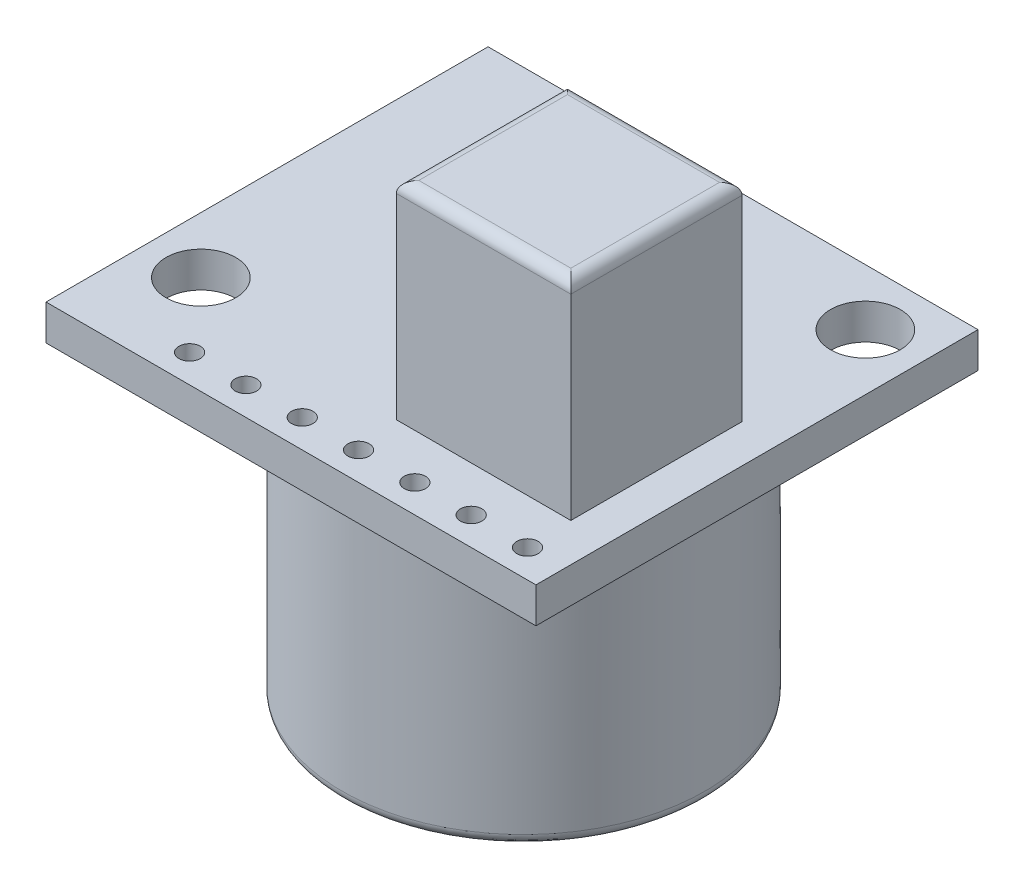
ISO-10303-21;
HEADER;
FILE_DESCRIPTION(('STEP AP214'),'2;1');
FILE_NAME('part.step','',(''),(''),'','','');
FILE_SCHEMA(('AUTOMOTIVE_DESIGN { 1 0 10303 214 1 1 1 1 }'));
ENDSEC;
DATA;
#1=APPLICATION_CONTEXT('core data for automotive mechanical design processes');
#2=APPLICATION_PROTOCOL_DEFINITION('international standard','automotive_design',2000,#1);
#3=PRODUCT_CONTEXT('',#1,'mechanical');
#4=PRODUCT('Part','Part','',(#3));
#5=PRODUCT_RELATED_PRODUCT_CATEGORY('part','',(#4));
#6=PRODUCT_DEFINITION_FORMATION('','',#4);
#7=PRODUCT_DEFINITION_CONTEXT('part definition',#1,'design');
#8=PRODUCT_DEFINITION('design','',#6,#7);
#9=PRODUCT_DEFINITION_SHAPE('','',#8);
#10=(LENGTH_UNIT() NAMED_UNIT(*) SI_UNIT(.MILLI.,.METRE.));
#11=(NAMED_UNIT(*) PLANE_ANGLE_UNIT() SI_UNIT($,.RADIAN.));
#12=(NAMED_UNIT(*) SI_UNIT($,.STERADIAN.) SOLID_ANGLE_UNIT());
#13=UNCERTAINTY_MEASURE_WITH_UNIT(LENGTH_MEASURE(1.E-05),#10,'distance_accuracy_value','');
#14=(GEOMETRIC_REPRESENTATION_CONTEXT(3) GLOBAL_UNCERTAINTY_ASSIGNED_CONTEXT((#13)) GLOBAL_UNIT_ASSIGNED_CONTEXT((#10,
#11,#12)) REPRESENTATION_CONTEXT('',''));
#15=CARTESIAN_POINT('',(0.,0.,0.));
#16=DIRECTION('',(0.,0.,1.));
#17=DIRECTION('',(1.,0.,0.));
#18=AXIS2_PLACEMENT_3D('',#15,#16,#17);
#19=CARTESIAN_POINT('',(0.,0.,0.));
#20=DIRECTION('',(0.,1.,0.));
#21=DIRECTION('',(0.,0.,1.));
#22=AXIS2_PLACEMENT_3D('',#19,#20,#21);
#23=PLANE('',#22);
#24=CARTESIAN_POINT('',(-5.842,0.,8.6995000000001));
#25=DIRECTION('',(0.,1.,0.));
#26=DIRECTION('',(0.,0.,1.));
#27=AXIS2_PLACEMENT_3D('',#24,#25,#26);
#28=CIRCLE('',#27,0.482599999999999);
#29=CARTESIAN_POINT('',(-5.842,0.,9.1821000000001));
#30=VERTEX_POINT('',#29);
#31=EDGE_CURVE('E201',#30,#30,#28,.T.);
#32=ORIENTED_EDGE('',*,*,#31,.T.);
#33=EDGE_LOOP('',(#32));
#34=FACE_BOUND('',#33,.T.);
#35=CARTESIAN_POINT('',(-3.302,0.,8.69950000000009));
#36=DIRECTION('',(0.,1.,0.));
#37=DIRECTION('',(0.,0.,1.));
#38=AXIS2_PLACEMENT_3D('',#35,#36,#37);
#39=CIRCLE('',#38,0.482599999999999);
#40=CARTESIAN_POINT('',(-3.302,0.,9.18210000000009));
#41=VERTEX_POINT('',#40);
#42=EDGE_CURVE('E205',#41,#41,#39,.T.);
#43=ORIENTED_EDGE('',*,*,#42,.T.);
#44=EDGE_LOOP('',(#43));
#45=FACE_BOUND('',#44,.T.);
#46=CARTESIAN_POINT('',(-0.762000000000002,0.,8.69950000000007));
#47=DIRECTION('',(0.,1.,0.));
#48=DIRECTION('',(0.,0.,1.));
#49=AXIS2_PLACEMENT_3D('',#46,#47,#48);
#50=CIRCLE('',#49,0.482599999999999);
#51=CARTESIAN_POINT('',(-0.762000000000002,0.,9.18210000000007));
#52=VERTEX_POINT('',#51);
#53=EDGE_CURVE('E211',#52,#52,#50,.T.);
#54=ORIENTED_EDGE('',*,*,#53,.T.);
#55=EDGE_LOOP('',(#54));
#56=FACE_BOUND('',#55,.T.);
#57=CARTESIAN_POINT('',(1.778,0.,8.69950000000005));
#58=DIRECTION('',(0.,1.,0.));
#59=DIRECTION('',(0.,0.,1.));
#60=AXIS2_PLACEMENT_3D('',#57,#58,#59);
#61=CIRCLE('',#60,0.482599999999999);
#62=CARTESIAN_POINT('',(1.778,0.,9.18210000000005));
#63=VERTEX_POINT('',#62);
#64=EDGE_CURVE('E217',#63,#63,#61,.T.);
#65=ORIENTED_EDGE('',*,*,#64,.T.);
#66=EDGE_LOOP('',(#65));
#67=FACE_BOUND('',#66,.T.);
#68=CARTESIAN_POINT('',(4.318,0.,8.69950000000003));
#69=DIRECTION('',(0.,1.,0.));
#70=DIRECTION('',(0.,0.,1.));
#71=AXIS2_PLACEMENT_3D('',#68,#69,#70);
#72=CIRCLE('',#71,0.482599999999999);
#73=CARTESIAN_POINT('',(4.318,0.,9.18210000000003));
#74=VERTEX_POINT('',#73);
#75=EDGE_CURVE('E223',#74,#74,#72,.T.);
#76=ORIENTED_EDGE('',*,*,#75,.T.);
#77=EDGE_LOOP('',(#76));
#78=FACE_BOUND('',#77,.T.);
#79=CARTESIAN_POINT('',(6.858,0.,8.69950000000001));
#80=DIRECTION('',(0.,1.,0.));
#81=DIRECTION('',(0.,0.,1.));
#82=AXIS2_PLACEMENT_3D('',#79,#80,#81);
#83=CIRCLE('',#82,0.482599999999999);
#84=CARTESIAN_POINT('',(6.858,0.,9.18210000000001));
#85=VERTEX_POINT('',#84);
#86=EDGE_CURVE('E229',#85,#85,#83,.T.);
#87=ORIENTED_EDGE('',*,*,#86,.T.);
#88=EDGE_LOOP('',(#87));
#89=FACE_BOUND('',#88,.T.);
#90=CARTESIAN_POINT('',(9.398,0.,8.6995));
#91=DIRECTION('',(0.,1.,0.));
#92=DIRECTION('',(0.,0.,1.));
#93=AXIS2_PLACEMENT_3D('',#90,#91,#92);
#94=CIRCLE('',#93,0.482599999999999);
#95=CARTESIAN_POINT('',(9.398,0.,9.1821));
#96=VERTEX_POINT('',#95);
#97=EDGE_CURVE('E235',#96,#96,#94,.T.);
#98=ORIENTED_EDGE('',*,*,#97,.T.);
#99=EDGE_LOOP('',(#98));
#100=FACE_BOUND('',#99,.T.);
#101=CARTESIAN_POINT('',(-8.509,0.,5.5245));
#102=DIRECTION('',(0.,1.,0.));
#103=DIRECTION('',(0.,0.,1.));
#104=AXIS2_PLACEMENT_3D('',#101,#102,#103);
#105=CIRCLE('',#104,1.5748);
#106=CARTESIAN_POINT('',(-8.509,0.,7.0993));
#107=VERTEX_POINT('',#106);
#108=EDGE_CURVE('E241',#107,#107,#105,.T.);
#109=ORIENTED_EDGE('',*,*,#108,.T.);
#110=EDGE_LOOP('',(#109));
#111=FACE_BOUND('',#110,.T.);
#112=CARTESIAN_POINT('',(8.509,0.,-7.4295));
#113=DIRECTION('',(0.,1.,0.));
#114=DIRECTION('',(0.,0.,1.));
#115=AXIS2_PLACEMENT_3D('',#112,#113,#114);
#116=CIRCLE('',#115,1.5748);
#117=CARTESIAN_POINT('',(8.509,0.,-5.8547));
#118=VERTEX_POINT('',#117);
#119=EDGE_CURVE('E247',#118,#118,#116,.T.);
#120=ORIENTED_EDGE('',*,*,#119,.T.);
#121=EDGE_LOOP('',(#120));
#122=FACE_BOUND('',#121,.T.);
#123=DIRECTION('',(0.,0.,1.));
#124=VECTOR('',#123,1.);
#125=CARTESIAN_POINT('',(-11.049,0.,-9.9695));
#126=LINE('',#125,#124);
#127=CARTESIAN_POINT('',(-11.049,0.,-9.9695));
#128=VERTEX_POINT('',#127);
#129=CARTESIAN_POINT('',(-11.049,0.,9.9695));
#130=VERTEX_POINT('',#129);
#131=EDGE_CURVE('E253',#128,#130,#126,.T.);
#132=ORIENTED_EDGE('',*,*,#131,.F.);
#133=DIRECTION('',(-1.,0.,0.));
#134=VECTOR('',#133,1.);
#135=CARTESIAN_POINT('',(-11.049,0.,-9.9695));
#136=LINE('',#135,#134);
#137=CARTESIAN_POINT('',(11.049,0.,-9.9695));
#138=VERTEX_POINT('',#137);
#139=EDGE_CURVE('E260',#138,#128,#136,.T.);
#140=ORIENTED_EDGE('',*,*,#139,.F.);
#141=DIRECTION('',(0.,0.,-1.));
#142=VECTOR('',#141,1.);
#143=CARTESIAN_POINT('',(11.049,0.,-9.9695));
#144=LINE('',#143,#142);
#145=CARTESIAN_POINT('',(11.049,0.,9.9695));
#146=VERTEX_POINT('',#145);
#147=EDGE_CURVE('E271',#146,#138,#144,.T.);
#148=ORIENTED_EDGE('',*,*,#147,.F.);
#149=DIRECTION('',(1.,0.,0.));
#150=VECTOR('',#149,1.);
#151=CARTESIAN_POINT('',(-11.049,0.,9.9695));
#152=LINE('',#151,#150);
#153=EDGE_CURVE('E269',#130,#146,#152,.T.);
#154=ORIENTED_EDGE('',*,*,#153,.F.);
#155=EDGE_LOOP('',(#132,#140,#148,#154));
#156=FACE_BOUND('',#155,.T.);
#157=DIRECTION('',(0.,0.,1.));
#158=VECTOR('',#157,1.);
#159=CARTESIAN_POINT('',(-5.969,0.,-7.9375));
#160=LINE('',#159,#158);
#161=CARTESIAN_POINT('',(-5.969,0.,-7.9375));
#162=VERTEX_POINT('',#161);
#163=CARTESIAN_POINT('',(-5.969,0.,-6.13066535194291));
#164=VERTEX_POINT('',#163);
#165=EDGE_CURVE('E327',#162,#164,#160,.T.);
#166=ORIENTED_EDGE('',*,*,#165,.F.);
#167=DIRECTION('',(1.,0.,0.));
#168=VECTOR('',#167,1.);
#169=CARTESIAN_POINT('',(-10.541,0.,-7.9375));
#170=LINE('',#169,#168);
#171=CARTESIAN_POINT('',(-10.541,0.,-7.9375));
#172=VERTEX_POINT('',#171);
#173=EDGE_CURVE('E325',#172,#162,#170,.T.);
#174=ORIENTED_EDGE('',*,*,#173,.F.);
#175=DIRECTION('',(0.,0.,-1.));
#176=VECTOR('',#175,1.);
#177=CARTESIAN_POINT('',(-10.541,0.,-7.9375));
#178=LINE('',#177,#176);
#179=CARTESIAN_POINT('',(-10.541,0.,-1.3335));
#180=VERTEX_POINT('',#179);
#181=EDGE_CURVE('E170',#180,#172,#178,.T.);
#182=ORIENTED_EDGE('',*,*,#181,.F.);
#183=DIRECTION('',(-1.,0.,0.));
#184=VECTOR('',#183,1.);
#185=CARTESIAN_POINT('',(-10.541,0.,-1.3335));
#186=LINE('',#185,#184);
#187=CARTESIAN_POINT('',(-8.15107529164097,0.,-1.3335));
#188=VERTEX_POINT('',#187);
#189=EDGE_CURVE('E167',#188,#180,#186,.T.);
#190=ORIENTED_EDGE('',*,*,#189,.F.);
#191=CARTESIAN_POINT('',(0.,0.,-0.520699999999999));
#192=DIRECTION('',(0.,-1.,0.));
#193=DIRECTION('',(0.,0.,-1.));
#194=AXIS2_PLACEMENT_3D('',#191,#192,#193);
#195=CIRCLE('',#194,8.1915);
#196=EDGE_CURVE('E180',#164,#188,#195,.T.);
#197=ORIENTED_EDGE('',*,*,#196,.F.);
#198=EDGE_LOOP('',(#166,#174,#182,#190,#197));
#199=FACE_BOUND('',#198,.T.);
#200=ADVANCED_FACE('F37',(#34,#45,#56,#67,#78,#89,#100,#111,#122,#156,#199),#23,.F.);
#201=CARTESIAN_POINT('',(0.,-13.6398,-0.520699999999999));
#202=DIRECTION('',(0.,1.,0.));
#203=DIRECTION('',(0.,0.,1.));
#204=AXIS2_PLACEMENT_3D('',#201,#202,#203);
#205=CYLINDRICAL_SURFACE('',#204,8.1915);
#206=CARTESIAN_POINT('',(0.,-13.1318,-0.520699999999999));
#207=DIRECTION('',(0.,-1.,0.));
#208=DIRECTION('',(0.,0.,-1.));
#209=AXIS2_PLACEMENT_3D('',#206,#207,#208);
#210=CIRCLE('',#209,8.1915);
#211=CARTESIAN_POINT('',(0.,-13.1318,-8.7122));
#212=VERTEX_POINT('',#211);
#213=EDGE_CURVE('E294',#212,#212,#210,.F.);
#214=ORIENTED_EDGE('',*,*,#213,.T.);
#215=EDGE_LOOP('',(#214));
#216=FACE_BOUND('',#215,.T.);
#217=DIRECTION('',(0.,1.,0.));
#218=VECTOR('',#217,1.);
#219=CARTESIAN_POINT('',(-5.969,-13.6398,-6.13066535194291));
#220=LINE('',#219,#218);
#221=CARTESIAN_POINT('',(-5.969,-2.032,-6.13066535194291));
#222=VERTEX_POINT('',#221);
#223=EDGE_CURVE('E288',#164,#222,#220,.F.);
#224=ORIENTED_EDGE('',*,*,#223,.F.);
#225=ORIENTED_EDGE('',*,*,#196,.T.);
#226=DIRECTION('',(0.,1.,0.));
#227=VECTOR('',#226,1.);
#228=CARTESIAN_POINT('',(-8.15107529164097,-13.6398,-1.3335));
#229=LINE('',#228,#227);
#230=CARTESIAN_POINT('',(-8.15107529164097,-2.032,-1.3335));
#231=VERTEX_POINT('',#230);
#232=EDGE_CURVE('E285',#231,#188,#229,.T.);
#233=ORIENTED_EDGE('',*,*,#232,.F.);
#234=CARTESIAN_POINT('',(0.,-2.032,-0.520699999999999));
#235=DIRECTION('',(0.,1.,0.));
#236=DIRECTION('',(0.,0.,1.));
#237=AXIS2_PLACEMENT_3D('',#234,#235,#236);
#238=CIRCLE('',#237,8.1915);
#239=EDGE_CURVE('E182',#222,#231,#238,.T.);
#240=ORIENTED_EDGE('',*,*,#239,.F.);
#241=EDGE_LOOP('',(#224,#225,#233,#240));
#242=FACE_BOUND('',#241,.T.);
#243=ADVANCED_FACE('F339',(#216,#242),#205,.T.);
#244=CARTESIAN_POINT('',(0.,1.6002,0.));
#245=DIRECTION('',(0.,1.,0.));
#246=DIRECTION('',(0.,0.,1.));
#247=AXIS2_PLACEMENT_3D('',#244,#245,#246);
#248=PLANE('',#247);
#249=CARTESIAN_POINT('',(-3.302,1.6002,8.69950000000009));
#250=DIRECTION('',(0.,1.,0.));
#251=DIRECTION('',(0.,0.,1.));
#252=AXIS2_PLACEMENT_3D('',#249,#250,#251);
#253=CIRCLE('',#252,0.482599999999999);
#254=CARTESIAN_POINT('',(-3.302,1.6002,9.18210000000009));
#255=VERTEX_POINT('',#254);
#256=EDGE_CURVE('E208',#255,#255,#253,.T.);
#257=ORIENTED_EDGE('',*,*,#256,.F.);
#258=EDGE_LOOP('',(#257));
#259=FACE_BOUND('',#258,.T.);
#260=CARTESIAN_POINT('',(1.778,1.6002,8.69950000000005));
#261=DIRECTION('',(0.,1.,0.));
#262=DIRECTION('',(0.,0.,1.));
#263=AXIS2_PLACEMENT_3D('',#260,#261,#262);
#264=CIRCLE('',#263,0.482599999999999);
#265=CARTESIAN_POINT('',(1.778,1.6002,9.18210000000005));
#266=VERTEX_POINT('',#265);
#267=EDGE_CURVE('E220',#266,#266,#264,.T.);
#268=ORIENTED_EDGE('',*,*,#267,.F.);
#269=EDGE_LOOP('',(#268));
#270=FACE_BOUND('',#269,.T.);
#271=CARTESIAN_POINT('',(6.858,1.6002,8.69950000000001));
#272=DIRECTION('',(0.,1.,0.));
#273=DIRECTION('',(0.,0.,1.));
#274=AXIS2_PLACEMENT_3D('',#271,#272,#273);
#275=CIRCLE('',#274,0.482599999999999);
#276=CARTESIAN_POINT('',(6.858,1.6002,9.18210000000001));
#277=VERTEX_POINT('',#276);
#278=EDGE_CURVE('E232',#277,#277,#275,.T.);
#279=ORIENTED_EDGE('',*,*,#278,.F.);
#280=EDGE_LOOP('',(#279));
#281=FACE_BOUND('',#280,.T.);
#282=CARTESIAN_POINT('',(-8.509,1.6002,5.5245));
#283=DIRECTION('',(0.,1.,0.));
#284=DIRECTION('',(0.,0.,1.));
#285=AXIS2_PLACEMENT_3D('',#282,#283,#284);
#286=CIRCLE('',#285,1.5748);
#287=CARTESIAN_POINT('',(-8.509,1.6002,7.0993));
#288=VERTEX_POINT('',#287);
#289=EDGE_CURVE('E244',#288,#288,#286,.T.);
#290=ORIENTED_EDGE('',*,*,#289,.F.);
#291=EDGE_LOOP('',(#290));
#292=FACE_BOUND('',#291,.T.);
#293=DIRECTION('',(0.,0.,1.));
#294=VECTOR('',#293,1.);
#295=CARTESIAN_POINT('',(-11.049,1.6002,-9.9695));
#296=LINE('',#295,#294);
#297=CARTESIAN_POINT('',(-11.049,1.6002,-9.9695));
#298=VERTEX_POINT('',#297);
#299=CARTESIAN_POINT('',(-11.049,1.6002,9.9695));
#300=VERTEX_POINT('',#299);
#301=EDGE_CURVE('E256',#298,#300,#296,.T.);
#302=ORIENTED_EDGE('',*,*,#301,.T.);
#303=DIRECTION('',(1.,0.,0.));
#304=VECTOR('',#303,1.);
#305=CARTESIAN_POINT('',(-11.049,1.6002,9.9695));
#306=LINE('',#305,#304);
#307=CARTESIAN_POINT('',(11.049,1.6002,9.9695));
#308=VERTEX_POINT('',#307);
#309=EDGE_CURVE('E259',#300,#308,#306,.T.);
#310=ORIENTED_EDGE('',*,*,#309,.T.);
#311=DIRECTION('',(0.,0.,-1.));
#312=VECTOR('',#311,1.);
#313=CARTESIAN_POINT('',(11.049,1.6002,-9.9695));
#314=LINE('',#313,#312);
#315=CARTESIAN_POINT('',(11.049,1.6002,-9.9695));
#316=VERTEX_POINT('',#315);
#317=EDGE_CURVE('E262',#308,#316,#314,.T.);
#318=ORIENTED_EDGE('',*,*,#317,.T.);
#319=DIRECTION('',(-1.,0.,0.));
#320=VECTOR('',#319,1.);
#321=CARTESIAN_POINT('',(-11.049,1.6002,-9.9695));
#322=LINE('',#321,#320);
#323=EDGE_CURVE('E264',#316,#298,#322,.T.);
#324=ORIENTED_EDGE('',*,*,#323,.T.);
#325=EDGE_LOOP('',(#302,#310,#318,#324));
#326=FACE_BOUND('',#325,.T.);
#327=CARTESIAN_POINT('',(8.509,1.6002,-7.4295));
#328=DIRECTION('',(0.,1.,0.));
#329=DIRECTION('',(0.,0.,1.));
#330=AXIS2_PLACEMENT_3D('',#327,#328,#329);
#331=CIRCLE('',#330,1.5748);
#332=CARTESIAN_POINT('',(8.509,1.6002,-5.8547));
#333=VERTEX_POINT('',#332);
#334=EDGE_CURVE('E250',#333,#333,#331,.T.);
#335=ORIENTED_EDGE('',*,*,#334,.F.);
#336=EDGE_LOOP('',(#335));
#337=FACE_BOUND('',#336,.T.);
#338=CARTESIAN_POINT('',(9.398,1.6002,8.6995));
#339=DIRECTION('',(0.,1.,0.));
#340=DIRECTION('',(0.,0.,1.));
#341=AXIS2_PLACEMENT_3D('',#338,#339,#340);
#342=CIRCLE('',#341,0.482599999999999);
#343=CARTESIAN_POINT('',(9.398,1.6002,9.1821));
#344=VERTEX_POINT('',#343);
#345=EDGE_CURVE('E238',#344,#344,#342,.T.);
#346=ORIENTED_EDGE('',*,*,#345,.F.);
#347=EDGE_LOOP('',(#346));
#348=FACE_BOUND('',#347,.T.);
#349=CARTESIAN_POINT('',(4.318,1.6002,8.69950000000003));
#350=DIRECTION('',(0.,1.,0.));
#351=DIRECTION('',(0.,0.,1.));
#352=AXIS2_PLACEMENT_3D('',#349,#350,#351);
#353=CIRCLE('',#352,0.482599999999999);
#354=CARTESIAN_POINT('',(4.318,1.6002,9.18210000000003));
#355=VERTEX_POINT('',#354);
#356=EDGE_CURVE('E226',#355,#355,#353,.T.);
#357=ORIENTED_EDGE('',*,*,#356,.F.);
#358=EDGE_LOOP('',(#357));
#359=FACE_BOUND('',#358,.T.);
#360=CARTESIAN_POINT('',(-0.762000000000002,1.6002,8.69950000000007));
#361=DIRECTION('',(0.,1.,0.));
#362=DIRECTION('',(0.,0.,1.));
#363=AXIS2_PLACEMENT_3D('',#360,#361,#362);
#364=CIRCLE('',#363,0.482599999999999);
#365=CARTESIAN_POINT('',(-0.762000000000002,1.6002,9.18210000000007));
#366=VERTEX_POINT('',#365);
#367=EDGE_CURVE('E214',#366,#366,#364,.T.);
#368=ORIENTED_EDGE('',*,*,#367,.F.);
#369=EDGE_LOOP('',(#368));
#370=FACE_BOUND('',#369,.T.);
#371=CARTESIAN_POINT('',(-5.842,1.6002,8.6995000000001));
#372=DIRECTION('',(0.,1.,0.));
#373=DIRECTION('',(0.,0.,1.));
#374=AXIS2_PLACEMENT_3D('',#371,#372,#373);
#375=CIRCLE('',#374,0.482599999999999);
#376=CARTESIAN_POINT('',(-5.842,1.6002,9.1821000000001));
#377=VERTEX_POINT('',#376);
#378=EDGE_CURVE('E202',#377,#377,#375,.T.);
#379=ORIENTED_EDGE('',*,*,#378,.F.);
#380=EDGE_LOOP('',(#379));
#381=FACE_BOUND('',#380,.T.);
#382=DIRECTION('',(1.,0.,0.));
#383=VECTOR('',#382,1.);
#384=CARTESIAN_POINT('',(1.4478,1.6002,6.6675));
#385=LINE('',#384,#383);
#386=CARTESIAN_POINT('',(1.4478,1.6002,6.6675));
#387=VERTEX_POINT('',#386);
#388=CARTESIAN_POINT('',(9.3218,1.6002,6.6675));
#389=VERTEX_POINT('',#388);
#390=EDGE_CURVE('E174',#387,#389,#385,.T.);
#391=ORIENTED_EDGE('',*,*,#390,.F.);
#392=DIRECTION('',(0.,0.,1.));
#393=VECTOR('',#392,1.);
#394=CARTESIAN_POINT('',(1.4478,1.6002,-1.0541));
#395=LINE('',#394,#393);
#396=CARTESIAN_POINT('',(1.4478,1.6002,-1.0541));
#397=VERTEX_POINT('',#396);
#398=EDGE_CURVE('E171',#397,#387,#395,.T.);
#399=ORIENTED_EDGE('',*,*,#398,.F.);
#400=DIRECTION('',(-1.,0.,0.));
#401=VECTOR('',#400,1.);
#402=CARTESIAN_POINT('',(1.4478,1.6002,-1.0541));
#403=LINE('',#402,#401);
#404=CARTESIAN_POINT('',(9.3218,1.6002,-1.0541));
#405=VERTEX_POINT('',#404);
#406=EDGE_CURVE('E190',#405,#397,#403,.T.);
#407=ORIENTED_EDGE('',*,*,#406,.F.);
#408=DIRECTION('',(0.,0.,-1.));
#409=VECTOR('',#408,1.);
#410=CARTESIAN_POINT('',(9.3218,1.6002,-1.0541));
#411=LINE('',#410,#409);
#412=EDGE_CURVE('E187',#389,#405,#411,.T.);
#413=ORIENTED_EDGE('',*,*,#412,.F.);
#414=EDGE_LOOP('',(#391,#399,#407,#413));
#415=FACE_BOUND('',#414,.T.);
#416=ADVANCED_FACE('F359',(#259,#270,#281,#292,#326,#337,#348,#359,#370,#381,#415),#248,.T.);
#417=CARTESIAN_POINT('',(-11.049,1.6002,-9.9695));
#418=DIRECTION('',(1.,0.,0.));
#419=DIRECTION('',(0.,0.,-1.));
#420=AXIS2_PLACEMENT_3D('',#417,#418,#419);
#421=PLANE('',#420);
#422=ORIENTED_EDGE('',*,*,#131,.T.);
#423=DIRECTION('',(0.,-1.,0.));
#424=VECTOR('',#423,1.);
#425=CARTESIAN_POINT('',(-11.049,1.6002,9.9695));
#426=LINE('',#425,#424);
#427=EDGE_CURVE('E183',#300,#130,#426,.T.);
#428=ORIENTED_EDGE('',*,*,#427,.F.);
#429=ORIENTED_EDGE('',*,*,#301,.F.);
#430=DIRECTION('',(0.,-1.,0.));
#431=VECTOR('',#430,1.);
#432=CARTESIAN_POINT('',(-11.049,1.6002,-9.9695));
#433=LINE('',#432,#431);
#434=EDGE_CURVE('E266',#298,#128,#433,.T.);
#435=ORIENTED_EDGE('',*,*,#434,.T.);
#436=EDGE_LOOP('',(#422,#428,#429,#435));
#437=FACE_BOUND('',#436,.T.);
#438=ADVANCED_FACE('F378',(#437),#421,.F.);
#439=CARTESIAN_POINT('',(-11.049,1.6002,9.9695));
#440=DIRECTION('',(0.,0.,-1.));
#441=DIRECTION('',(-1.,0.,0.));
#442=AXIS2_PLACEMENT_3D('',#439,#440,#441);
#443=PLANE('',#442);
#444=ORIENTED_EDGE('',*,*,#153,.T.);
#445=DIRECTION('',(0.,-1.,0.));
#446=VECTOR('',#445,1.);
#447=CARTESIAN_POINT('',(11.049,1.6002,9.9695));
#448=LINE('',#447,#446);
#449=EDGE_CURVE('E279',#308,#146,#448,.T.);
#450=ORIENTED_EDGE('',*,*,#449,.F.);
#451=ORIENTED_EDGE('',*,*,#309,.F.);
#452=ORIENTED_EDGE('',*,*,#427,.T.);
#453=EDGE_LOOP('',(#444,#450,#451,#452));
#454=FACE_BOUND('',#453,.T.);
#455=ADVANCED_FACE('F374',(#454),#443,.F.);
#456=CARTESIAN_POINT('',(11.049,1.6002,-9.9695));
#457=DIRECTION('',(-1.,0.,0.));
#458=DIRECTION('',(0.,0.,1.));
#459=AXIS2_PLACEMENT_3D('',#456,#457,#458);
#460=PLANE('',#459);
#461=ORIENTED_EDGE('',*,*,#147,.T.);
#462=DIRECTION('',(0.,-1.,0.));
#463=VECTOR('',#462,1.);
#464=CARTESIAN_POINT('',(11.049,1.6002,-9.9695));
#465=LINE('',#464,#463);
#466=EDGE_CURVE('E276',#316,#138,#465,.T.);
#467=ORIENTED_EDGE('',*,*,#466,.F.);
#468=ORIENTED_EDGE('',*,*,#317,.F.);
#469=ORIENTED_EDGE('',*,*,#449,.T.);
#470=EDGE_LOOP('',(#461,#467,#468,#469));
#471=FACE_BOUND('',#470,.T.);
#472=ADVANCED_FACE('F370',(#471),#460,.F.);
#473=CARTESIAN_POINT('',(-11.049,1.6002,-9.9695));
#474=DIRECTION('',(0.,0.,1.));
#475=DIRECTION('',(1.,0.,0.));
#476=AXIS2_PLACEMENT_3D('',#473,#474,#475);
#477=PLANE('',#476);
#478=ORIENTED_EDGE('',*,*,#139,.T.);
#479=ORIENTED_EDGE('',*,*,#434,.F.);
#480=ORIENTED_EDGE('',*,*,#323,.F.);
#481=ORIENTED_EDGE('',*,*,#466,.T.);
#482=EDGE_LOOP('',(#478,#479,#480,#481));
#483=FACE_BOUND('',#482,.T.);
#484=ADVANCED_FACE('F366',(#483),#477,.F.);
#485=CARTESIAN_POINT('',(8.509,1.6002,-7.4295));
#486=DIRECTION('',(0.,-1.,0.));
#487=DIRECTION('',(0.,0.,-1.));
#488=AXIS2_PLACEMENT_3D('',#485,#486,#487);
#489=CYLINDRICAL_SURFACE('',#488,1.5748);
#490=ORIENTED_EDGE('',*,*,#334,.T.);
#491=EDGE_LOOP('',(#490));
#492=FACE_BOUND('',#491,.T.);
#493=ORIENTED_EDGE('',*,*,#119,.F.);
#494=EDGE_LOOP('',(#493));
#495=FACE_BOUND('',#494,.T.);
#496=ADVANCED_FACE('F369',(#492,#495),#489,.F.);
#497=CARTESIAN_POINT('',(-8.509,1.6002,5.5245));
#498=DIRECTION('',(0.,-1.,0.));
#499=DIRECTION('',(0.,0.,-1.));
#500=AXIS2_PLACEMENT_3D('',#497,#498,#499);
#501=CYLINDRICAL_SURFACE('',#500,1.5748);
#502=ORIENTED_EDGE('',*,*,#289,.T.);
#503=EDGE_LOOP('',(#502));
#504=FACE_BOUND('',#503,.T.);
#505=ORIENTED_EDGE('',*,*,#108,.F.);
#506=EDGE_LOOP('',(#505));
#507=FACE_BOUND('',#506,.T.);
#508=ADVANCED_FACE('F460',(#504,#507),#501,.F.);
#509=CARTESIAN_POINT('',(9.398,1.6002,8.6995));
#510=DIRECTION('',(0.,-1.,0.));
#511=DIRECTION('',(0.,0.,-1.));
#512=AXIS2_PLACEMENT_3D('',#509,#510,#511);
#513=CYLINDRICAL_SURFACE('',#512,0.482599999999999);
#514=ORIENTED_EDGE('',*,*,#345,.T.);
#515=EDGE_LOOP('',(#514));
#516=FACE_BOUND('',#515,.T.);
#517=ORIENTED_EDGE('',*,*,#97,.F.);
#518=EDGE_LOOP('',(#517));
#519=FACE_BOUND('',#518,.T.);
#520=ADVANCED_FACE('F456',(#516,#519),#513,.F.);
#521=CARTESIAN_POINT('',(6.858,1.6002,8.69950000000001));
#522=DIRECTION('',(0.,-1.,0.));
#523=DIRECTION('',(0.,0.,-1.));
#524=AXIS2_PLACEMENT_3D('',#521,#522,#523);
#525=CYLINDRICAL_SURFACE('',#524,0.482599999999999);
#526=ORIENTED_EDGE('',*,*,#278,.T.);
#527=EDGE_LOOP('',(#526));
#528=FACE_BOUND('',#527,.T.);
#529=ORIENTED_EDGE('',*,*,#86,.F.);
#530=EDGE_LOOP('',(#529));
#531=FACE_BOUND('',#530,.T.);
#532=ADVANCED_FACE('F452',(#528,#531),#525,.F.);
#533=CARTESIAN_POINT('',(4.318,1.6002,8.69950000000003));
#534=DIRECTION('',(0.,-1.,0.));
#535=DIRECTION('',(0.,0.,-1.));
#536=AXIS2_PLACEMENT_3D('',#533,#534,#535);
#537=CYLINDRICAL_SURFACE('',#536,0.482599999999999);
#538=ORIENTED_EDGE('',*,*,#356,.T.);
#539=EDGE_LOOP('',(#538));
#540=FACE_BOUND('',#539,.T.);
#541=ORIENTED_EDGE('',*,*,#75,.F.);
#542=EDGE_LOOP('',(#541));
#543=FACE_BOUND('',#542,.T.);
#544=ADVANCED_FACE('F448',(#540,#543),#537,.F.);
#545=CARTESIAN_POINT('',(1.778,1.6002,8.69950000000005));
#546=DIRECTION('',(0.,-1.,0.));
#547=DIRECTION('',(0.,0.,-1.));
#548=AXIS2_PLACEMENT_3D('',#545,#546,#547);
#549=CYLINDRICAL_SURFACE('',#548,0.482599999999999);
#550=ORIENTED_EDGE('',*,*,#267,.T.);
#551=EDGE_LOOP('',(#550));
#552=FACE_BOUND('',#551,.T.);
#553=ORIENTED_EDGE('',*,*,#64,.F.);
#554=EDGE_LOOP('',(#553));
#555=FACE_BOUND('',#554,.T.);
#556=ADVANCED_FACE('F444',(#552,#555),#549,.F.);
#557=CARTESIAN_POINT('',(-0.762000000000002,1.6002,8.69950000000007));
#558=DIRECTION('',(0.,-1.,0.));
#559=DIRECTION('',(0.,0.,-1.));
#560=AXIS2_PLACEMENT_3D('',#557,#558,#559);
#561=CYLINDRICAL_SURFACE('',#560,0.482599999999999);
#562=ORIENTED_EDGE('',*,*,#367,.T.);
#563=EDGE_LOOP('',(#562));
#564=FACE_BOUND('',#563,.T.);
#565=ORIENTED_EDGE('',*,*,#53,.F.);
#566=EDGE_LOOP('',(#565));
#567=FACE_BOUND('',#566,.T.);
#568=ADVANCED_FACE('F440',(#564,#567),#561,.F.);
#569=CARTESIAN_POINT('',(-3.302,1.6002,8.69950000000009));
#570=DIRECTION('',(0.,-1.,0.));
#571=DIRECTION('',(0.,0.,-1.));
#572=AXIS2_PLACEMENT_3D('',#569,#570,#571);
#573=CYLINDRICAL_SURFACE('',#572,0.482599999999999);
#574=ORIENTED_EDGE('',*,*,#256,.T.);
#575=EDGE_LOOP('',(#574));
#576=FACE_BOUND('',#575,.T.);
#577=ORIENTED_EDGE('',*,*,#42,.F.);
#578=EDGE_LOOP('',(#577));
#579=FACE_BOUND('',#578,.T.);
#580=ADVANCED_FACE('F436',(#576,#579),#573,.F.);
#581=CARTESIAN_POINT('',(-5.842,1.6002,8.6995000000001));
#582=DIRECTION('',(0.,-1.,0.));
#583=DIRECTION('',(0.,0.,-1.));
#584=AXIS2_PLACEMENT_3D('',#581,#582,#583);
#585=CYLINDRICAL_SURFACE('',#584,0.482599999999999);
#586=ORIENTED_EDGE('',*,*,#378,.T.);
#587=EDGE_LOOP('',(#586));
#588=FACE_BOUND('',#587,.T.);
#589=ORIENTED_EDGE('',*,*,#31,.F.);
#590=EDGE_LOOP('',(#589));
#591=FACE_BOUND('',#590,.T.);
#592=ADVANCED_FACE('F433',(#588,#591),#585,.F.);
#593=CARTESIAN_POINT('',(1.4478,10.9474,-1.0541));
#594=DIRECTION('',(1.,0.,0.));
#595=DIRECTION('',(0.,0.,-1.));
#596=AXIS2_PLACEMENT_3D('',#593,#594,#595);
#597=PLANE('',#596);
#598=DIRECTION('',(0.,-1.,0.));
#599=VECTOR('',#598,1.);
#600=CARTESIAN_POINT('',(1.4478,10.9474,6.6675));
#601=LINE('',#600,#599);
#602=CARTESIAN_POINT('',(1.4478,10.4394,6.6675));
#603=VERTEX_POINT('',#602);
#604=EDGE_CURVE('E199',#603,#387,#601,.T.);
#605=ORIENTED_EDGE('',*,*,#604,.F.);
#606=DIRECTION('',(0.,0.,1.));
#607=VECTOR('',#606,1.);
#608=CARTESIAN_POINT('',(1.4478,10.4394,-1.0541));
#609=LINE('',#608,#607);
#610=CARTESIAN_POINT('',(1.4478,10.4394,-1.0541));
#611=VERTEX_POINT('',#610);
#612=EDGE_CURVE('E309',#603,#611,#609,.F.);
#613=ORIENTED_EDGE('',*,*,#612,.T.);
#614=DIRECTION('',(0.,-1.,0.));
#615=VECTOR('',#614,1.);
#616=CARTESIAN_POINT('',(1.4478,10.9474,-1.0541));
#617=LINE('',#616,#615);
#618=EDGE_CURVE('E193',#611,#397,#617,.T.);
#619=ORIENTED_EDGE('',*,*,#618,.T.);
#620=ORIENTED_EDGE('',*,*,#398,.T.);
#621=EDGE_LOOP('',(#605,#613,#619,#620));
#622=FACE_BOUND('',#621,.T.);
#623=ADVANCED_FACE('F405',(#622),#597,.F.);
#624=CARTESIAN_POINT('',(1.4478,10.9474,6.6675));
#625=DIRECTION('',(0.,0.,-1.));
#626=DIRECTION('',(-1.,0.,0.));
#627=AXIS2_PLACEMENT_3D('',#624,#625,#626);
#628=PLANE('',#627);
#629=DIRECTION('',(0.,-1.,0.));
#630=VECTOR('',#629,1.);
#631=CARTESIAN_POINT('',(9.3218,10.9474,6.6675));
#632=LINE('',#631,#630);
#633=CARTESIAN_POINT('',(9.3218,10.4394,6.6675));
#634=VERTEX_POINT('',#633);
#635=EDGE_CURVE('E197',#634,#389,#632,.T.);
#636=ORIENTED_EDGE('',*,*,#635,.F.);
#637=DIRECTION('',(1.,0.,0.));
#638=VECTOR('',#637,1.);
#639=CARTESIAN_POINT('',(1.4478,10.4394,6.6675));
#640=LINE('',#639,#638);
#641=EDGE_CURVE('E46',#634,#603,#640,.F.);
#642=ORIENTED_EDGE('',*,*,#641,.T.);
#643=ORIENTED_EDGE('',*,*,#604,.T.);
#644=ORIENTED_EDGE('',*,*,#390,.T.);
#645=EDGE_LOOP('',(#636,#642,#643,#644));
#646=FACE_BOUND('',#645,.T.);
#647=ADVANCED_FACE('F428',(#646),#628,.F.);
#648=CARTESIAN_POINT('',(9.3218,10.9474,-1.0541));
#649=DIRECTION('',(-1.,0.,0.));
#650=DIRECTION('',(0.,0.,1.));
#651=AXIS2_PLACEMENT_3D('',#648,#649,#650);
#652=PLANE('',#651);
#653=DIRECTION('',(0.,-1.,0.));
#654=VECTOR('',#653,1.);
#655=CARTESIAN_POINT('',(9.3218,10.9474,-1.0541));
#656=LINE('',#655,#654);
#657=CARTESIAN_POINT('',(9.3218,10.4394,-1.0541));
#658=VERTEX_POINT('',#657);
#659=EDGE_CURVE('E195',#658,#405,#656,.T.);
#660=ORIENTED_EDGE('',*,*,#659,.F.);
#661=DIRECTION('',(0.,0.,-1.));
#662=VECTOR('',#661,1.);
#663=CARTESIAN_POINT('',(9.3218,10.4394,6.6675));
#664=LINE('',#663,#662);
#665=EDGE_CURVE('E11',#658,#634,#664,.F.);
#666=ORIENTED_EDGE('',*,*,#665,.T.);
#667=ORIENTED_EDGE('',*,*,#635,.T.);
#668=ORIENTED_EDGE('',*,*,#412,.T.);
#669=EDGE_LOOP('',(#660,#666,#667,#668));
#670=FACE_BOUND('',#669,.T.);
#671=ADVANCED_FACE('F423',(#670),#652,.F.);
#672=CARTESIAN_POINT('',(1.4478,10.9474,-1.0541));
#673=DIRECTION('',(0.,0.,1.));
#674=DIRECTION('',(1.,0.,0.));
#675=AXIS2_PLACEMENT_3D('',#672,#673,#674);
#676=PLANE('',#675);
#677=ORIENTED_EDGE('',*,*,#618,.F.);
#678=DIRECTION('',(-1.,0.,0.));
#679=VECTOR('',#678,1.);
#680=CARTESIAN_POINT('',(9.3218,10.4394,-1.0541));
#681=LINE('',#680,#679);
#682=EDGE_CURVE('E306',#611,#658,#681,.F.);
#683=ORIENTED_EDGE('',*,*,#682,.T.);
#684=ORIENTED_EDGE('',*,*,#659,.T.);
#685=ORIENTED_EDGE('',*,*,#406,.T.);
#686=EDGE_LOOP('',(#677,#683,#684,#685));
#687=FACE_BOUND('',#686,.T.);
#688=ADVANCED_FACE('F408',(#687),#676,.F.);
#689=CARTESIAN_POINT('',(0.,10.9474,0.));
#690=DIRECTION('',(0.,1.,0.));
#691=DIRECTION('',(0.,0.,1.));
#692=AXIS2_PLACEMENT_3D('',#689,#690,#691);
#693=PLANE('',#692);
#694=DIRECTION('',(0.,0.,-1.));
#695=VECTOR('',#694,1.);
#696=CARTESIAN_POINT('',(8.8138,10.9474,-1.0541));
#697=LINE('',#696,#695);
#698=CARTESIAN_POINT('',(8.8138,10.9474,6.1595));
#699=VERTEX_POINT('',#698);
#700=CARTESIAN_POINT('',(8.8138,10.9474,-0.546100000000002));
#701=VERTEX_POINT('',#700);
#702=EDGE_CURVE('E297',#699,#701,#697,.T.);
#703=ORIENTED_EDGE('',*,*,#702,.T.);
#704=DIRECTION('',(-1.,0.,0.));
#705=VECTOR('',#704,1.);
#706=CARTESIAN_POINT('',(1.4478,10.9474,-0.546100000000002));
#707=LINE('',#706,#705);
#708=CARTESIAN_POINT('',(1.9558,10.9474,-0.546100000000002));
#709=VERTEX_POINT('',#708);
#710=EDGE_CURVE('E303',#701,#709,#707,.T.);
#711=ORIENTED_EDGE('',*,*,#710,.T.);
#712=DIRECTION('',(0.,0.,1.));
#713=VECTOR('',#712,1.);
#714=CARTESIAN_POINT('',(1.9558,10.9474,6.6675));
#715=LINE('',#714,#713);
#716=CARTESIAN_POINT('',(1.9558,10.9474,6.1595));
#717=VERTEX_POINT('',#716);
#718=EDGE_CURVE('E301',#709,#717,#715,.T.);
#719=ORIENTED_EDGE('',*,*,#718,.T.);
#720=DIRECTION('',(1.,0.,0.));
#721=VECTOR('',#720,1.);
#722=CARTESIAN_POINT('',(9.3218,10.9474,6.1595));
#723=LINE('',#722,#721);
#724=EDGE_CURVE('E299',#717,#699,#723,.T.);
#725=ORIENTED_EDGE('',*,*,#724,.T.);
#726=EDGE_LOOP('',(#703,#711,#719,#725));
#727=FACE_BOUND('',#726,.T.);
#728=ADVANCED_FACE('F414',(#727),#693,.T.);
#729=CARTESIAN_POINT('',(0.,-13.6398,-0.520699999999999));
#730=DIRECTION('',(0.,-1.,0.));
#731=DIRECTION('',(0.,0.,-1.));
#732=AXIS2_PLACEMENT_3D('',#729,#730,#731);
#733=PLANE('',#732);
#734=CARTESIAN_POINT('',(0.,-13.6398,-0.520699999999999));
#735=DIRECTION('',(0.,-1.,0.));
#736=DIRECTION('',(0.,0.,-1.));
#737=AXIS2_PLACEMENT_3D('',#734,#735,#736);
#738=CIRCLE('',#737,7.6835);
#739=CARTESIAN_POINT('',(0.,-13.6398,-8.2042));
#740=VERTEX_POINT('',#739);
#741=EDGE_CURVE('E291',#740,#740,#738,.T.);
#742=ORIENTED_EDGE('',*,*,#741,.T.);
#743=EDGE_LOOP('',(#742));
#744=FACE_BOUND('',#743,.T.);
#745=ADVANCED_FACE('F350',(#744),#733,.T.);
#746=CARTESIAN_POINT('',(-5.969,-2.032,-7.9375));
#747=DIRECTION('',(-1.,0.,0.));
#748=DIRECTION('',(0.,0.,1.));
#749=AXIS2_PLACEMENT_3D('',#746,#747,#748);
#750=PLANE('',#749);
#751=ORIENTED_EDGE('',*,*,#165,.T.);
#752=ORIENTED_EDGE('',*,*,#223,.T.);
#753=DIRECTION('',(0.,0.,1.));
#754=VECTOR('',#753,1.);
#755=CARTESIAN_POINT('',(-5.969,-2.032,-7.9375));
#756=LINE('',#755,#754);
#757=CARTESIAN_POINT('',(-5.969,-2.032,-7.9375));
#758=VERTEX_POINT('',#757);
#759=EDGE_CURVE('E156',#758,#222,#756,.T.);
#760=ORIENTED_EDGE('',*,*,#759,.F.);
#761=DIRECTION('',(0.,1.,0.));
#762=VECTOR('',#761,1.);
#763=CARTESIAN_POINT('',(-5.969,-2.032,-7.9375));
#764=LINE('',#763,#762);
#765=EDGE_CURVE('E152',#758,#162,#764,.T.);
#766=ORIENTED_EDGE('',*,*,#765,.T.);
#767=EDGE_LOOP('',(#751,#752,#760,#766));
#768=FACE_BOUND('',#767,.T.);
#769=ADVANCED_FACE('F336',(#768),#750,.F.);
#770=CARTESIAN_POINT('',(-10.541,-2.032,-1.3335));
#771=DIRECTION('',(0.,0.,-1.));
#772=DIRECTION('',(-1.,0.,0.));
#773=AXIS2_PLACEMENT_3D('',#770,#771,#772);
#774=PLANE('',#773);
#775=DIRECTION('',(-1.,0.,0.));
#776=VECTOR('',#775,1.);
#777=CARTESIAN_POINT('',(-10.541,-2.032,-1.3335));
#778=LINE('',#777,#776);
#779=CARTESIAN_POINT('',(-10.541,-2.032,-1.3335));
#780=VERTEX_POINT('',#779);
#781=EDGE_CURVE('E163',#231,#780,#778,.T.);
#782=ORIENTED_EDGE('',*,*,#781,.F.);
#783=ORIENTED_EDGE('',*,*,#232,.T.);
#784=ORIENTED_EDGE('',*,*,#189,.T.);
#785=DIRECTION('',(0.,1.,0.));
#786=VECTOR('',#785,1.);
#787=CARTESIAN_POINT('',(-10.541,-2.032,-1.3335));
#788=LINE('',#787,#786);
#789=EDGE_CURVE('E176',#780,#180,#788,.T.);
#790=ORIENTED_EDGE('',*,*,#789,.F.);
#791=EDGE_LOOP('',(#782,#783,#784,#790));
#792=FACE_BOUND('',#791,.T.);
#793=ADVANCED_FACE('F342',(#792),#774,.F.);
#794=CARTESIAN_POINT('',(-10.541,-2.032,-7.9375));
#795=DIRECTION('',(1.,0.,0.));
#796=DIRECTION('',(0.,0.,-1.));
#797=AXIS2_PLACEMENT_3D('',#794,#795,#796);
#798=PLANE('',#797);
#799=ORIENTED_EDGE('',*,*,#181,.T.);
#800=DIRECTION('',(0.,1.,0.));
#801=VECTOR('',#800,1.);
#802=CARTESIAN_POINT('',(-10.541,-2.032,-7.9375));
#803=LINE('',#802,#801);
#804=CARTESIAN_POINT('',(-10.541,-2.032,-7.9375));
#805=VERTEX_POINT('',#804);
#806=EDGE_CURVE('E149',#805,#172,#803,.T.);
#807=ORIENTED_EDGE('',*,*,#806,.F.);
#808=DIRECTION('',(0.,0.,-1.));
#809=VECTOR('',#808,1.);
#810=CARTESIAN_POINT('',(-10.541,-2.032,-7.9375));
#811=LINE('',#810,#809);
#812=EDGE_CURVE('E157',#780,#805,#811,.T.);
#813=ORIENTED_EDGE('',*,*,#812,.F.);
#814=ORIENTED_EDGE('',*,*,#789,.T.);
#815=EDGE_LOOP('',(#799,#807,#813,#814));
#816=FACE_BOUND('',#815,.T.);
#817=ADVANCED_FACE('F169',(#816),#798,.F.);
#818=CARTESIAN_POINT('',(-10.541,-2.032,-7.9375));
#819=DIRECTION('',(0.,0.,1.));
#820=DIRECTION('',(1.,0.,0.));
#821=AXIS2_PLACEMENT_3D('',#818,#819,#820);
#822=PLANE('',#821);
#823=ORIENTED_EDGE('',*,*,#173,.T.);
#824=ORIENTED_EDGE('',*,*,#765,.F.);
#825=DIRECTION('',(1.,0.,0.));
#826=VECTOR('',#825,1.);
#827=CARTESIAN_POINT('',(-10.541,-2.032,-7.9375));
#828=LINE('',#827,#826);
#829=EDGE_CURVE('E144',#805,#758,#828,.T.);
#830=ORIENTED_EDGE('',*,*,#829,.F.);
#831=ORIENTED_EDGE('',*,*,#806,.T.);
#832=EDGE_LOOP('',(#823,#824,#830,#831));
#833=FACE_BOUND('',#832,.T.);
#834=ADVANCED_FACE('F147',(#833),#822,.F.);
#835=CARTESIAN_POINT('',(0.,-2.032,0.));
#836=DIRECTION('',(0.,1.,0.));
#837=DIRECTION('',(0.,0.,1.));
#838=AXIS2_PLACEMENT_3D('',#835,#836,#837);
#839=PLANE('',#838);
#840=ORIENTED_EDGE('',*,*,#759,.T.);
#841=ORIENTED_EDGE('',*,*,#239,.T.);
#842=ORIENTED_EDGE('',*,*,#781,.T.);
#843=ORIENTED_EDGE('',*,*,#812,.T.);
#844=ORIENTED_EDGE('',*,*,#829,.T.);
#845=EDGE_LOOP('',(#840,#841,#842,#843,#844));
#846=FACE_BOUND('',#845,.T.);
#847=ADVANCED_FACE('F160',(#846),#839,.F.);
#848=CARTESIAN_POINT('',(0.,-13.1318,-0.520699999999999));
#849=DIRECTION('',(0.,-1.,0.));
#850=DIRECTION('',(0.,0.,-1.));
#851=AXIS2_PLACEMENT_3D('',#848,#849,#850);
#852=TOROIDAL_SURFACE('',#851,7.6835,0.508);
#853=ORIENTED_EDGE('',*,*,#213,.F.);
#854=EDGE_LOOP('',(#853));
#855=FACE_BOUND('',#854,.T.);
#856=ORIENTED_EDGE('',*,*,#741,.F.);
#857=EDGE_LOOP('',(#856));
#858=FACE_BOUND('',#857,.T.);
#859=ADVANCED_FACE('F383',(#855,#858),#852,.T.);
#860=CARTESIAN_POINT('',(0.,10.4394,6.1595));
#861=DIRECTION('',(-1.,0.,0.));
#862=DIRECTION('',(0.,0.,1.));
#863=AXIS2_PLACEMENT_3D('',#860,#861,#862);
#864=CYLINDRICAL_SURFACE('',#863,0.508);
#865=CARTESIAN_POINT('',(1.9558,10.4394,6.1595));
#866=DIRECTION('',(-0.707106781186548,0.,-0.707106781186547));
#867=DIRECTION('',(-0.707106781186547,0.,0.707106781186548));
#868=AXIS2_PLACEMENT_3D('',#865,#866,#867);
#869=ELLIPSE('',#868,0.718420489685532,0.508);
#870=EDGE_CURVE('E315',#603,#717,#869,.T.);
#871=ORIENTED_EDGE('',*,*,#870,.F.);
#872=ORIENTED_EDGE('',*,*,#641,.F.);
#873=CARTESIAN_POINT('',(8.8138,10.4394,6.1595));
#874=DIRECTION('',(-0.707106781186547,0.,0.707106781186548));
#875=DIRECTION('',(0.707106781186548,0.,0.707106781186547));
#876=AXIS2_PLACEMENT_3D('',#873,#874,#875);
#877=ELLIPSE('',#876,0.718420489685532,0.508);
#878=EDGE_CURVE('E41',#699,#634,#877,.F.);
#879=ORIENTED_EDGE('',*,*,#878,.F.);
#880=ORIENTED_EDGE('',*,*,#724,.F.);
#881=EDGE_LOOP('',(#871,#872,#879,#880));
#882=FACE_BOUND('',#881,.T.);
#883=ADVANCED_FACE('F39',(#882),#864,.T.);
#884=CARTESIAN_POINT('',(8.8138,10.4394,0.));
#885=DIRECTION('',(0.,0.,1.));
#886=DIRECTION('',(1.,0.,0.));
#887=AXIS2_PLACEMENT_3D('',#884,#885,#886);
#888=CYLINDRICAL_SURFACE('',#887,0.508);
#889=ORIENTED_EDGE('',*,*,#878,.T.);
#890=ORIENTED_EDGE('',*,*,#665,.F.);
#891=CARTESIAN_POINT('',(8.8138,10.4394,-0.546100000000002));
#892=DIRECTION('',(0.707106781186548,0.,0.707106781186547));
#893=DIRECTION('',(-0.707106781186547,0.,0.707106781186548));
#894=AXIS2_PLACEMENT_3D('',#891,#892,#893);
#895=ELLIPSE('',#894,0.718420489685532,0.508);
#896=EDGE_CURVE('E314',#701,#658,#895,.F.);
#897=ORIENTED_EDGE('',*,*,#896,.F.);
#898=ORIENTED_EDGE('',*,*,#702,.F.);
#899=EDGE_LOOP('',(#889,#890,#897,#898));
#900=FACE_BOUND('',#899,.T.);
#901=ADVANCED_FACE('F393',(#900),#888,.T.);
#902=CARTESIAN_POINT('',(1.9558,10.4394,0.));
#903=DIRECTION('',(0.,0.,-1.));
#904=DIRECTION('',(-1.,0.,0.));
#905=AXIS2_PLACEMENT_3D('',#902,#903,#904);
#906=CYLINDRICAL_SURFACE('',#905,0.508);
#907=ORIENTED_EDGE('',*,*,#870,.T.);
#908=ORIENTED_EDGE('',*,*,#718,.F.);
#909=CARTESIAN_POINT('',(1.9558,10.4394,-0.546100000000002));
#910=DIRECTION('',(0.707106781186547,0.,-0.707106781186548));
#911=DIRECTION('',(-0.707106781186548,0.,-0.707106781186547));
#912=AXIS2_PLACEMENT_3D('',#909,#910,#911);
#913=ELLIPSE('',#912,0.718420489685532,0.508);
#914=EDGE_CURVE('E312',#611,#709,#913,.T.);
#915=ORIENTED_EDGE('',*,*,#914,.F.);
#916=ORIENTED_EDGE('',*,*,#612,.F.);
#917=EDGE_LOOP('',(#907,#908,#915,#916));
#918=FACE_BOUND('',#917,.T.);
#919=ADVANCED_FACE('F390',(#918),#906,.T.);
#920=CARTESIAN_POINT('',(0.,10.4394,-0.546100000000002));
#921=DIRECTION('',(1.,0.,0.));
#922=DIRECTION('',(0.,0.,-1.));
#923=AXIS2_PLACEMENT_3D('',#920,#921,#922);
#924=CYLINDRICAL_SURFACE('',#923,0.508);
#925=ORIENTED_EDGE('',*,*,#896,.T.);
#926=ORIENTED_EDGE('',*,*,#682,.F.);
#927=ORIENTED_EDGE('',*,*,#914,.T.);
#928=ORIENTED_EDGE('',*,*,#710,.F.);
#929=EDGE_LOOP('',(#925,#926,#927,#928));
#930=FACE_BOUND('',#929,.T.);
#931=ADVANCED_FACE('F387',(#930),#924,.T.);
#932=CLOSED_SHELL('',(#200,#243,#416,#438,#455,#472,#484,#496,#508,#520,#532,#544,#556,#568,
#580,#592,#623,#647,#671,#688,#728,#745,#769,#793,#817,#834,#847,#859,#883,#901,#919,#931));
#933=MANIFOLD_SOLID_BREP('B2',#932);
#934=ADVANCED_BREP_SHAPE_REPRESENTATION('',(#18,#933),#14);
#935=SHAPE_DEFINITION_REPRESENTATION(#9,#934);
ENDSEC;
END-ISO-10303-21;
